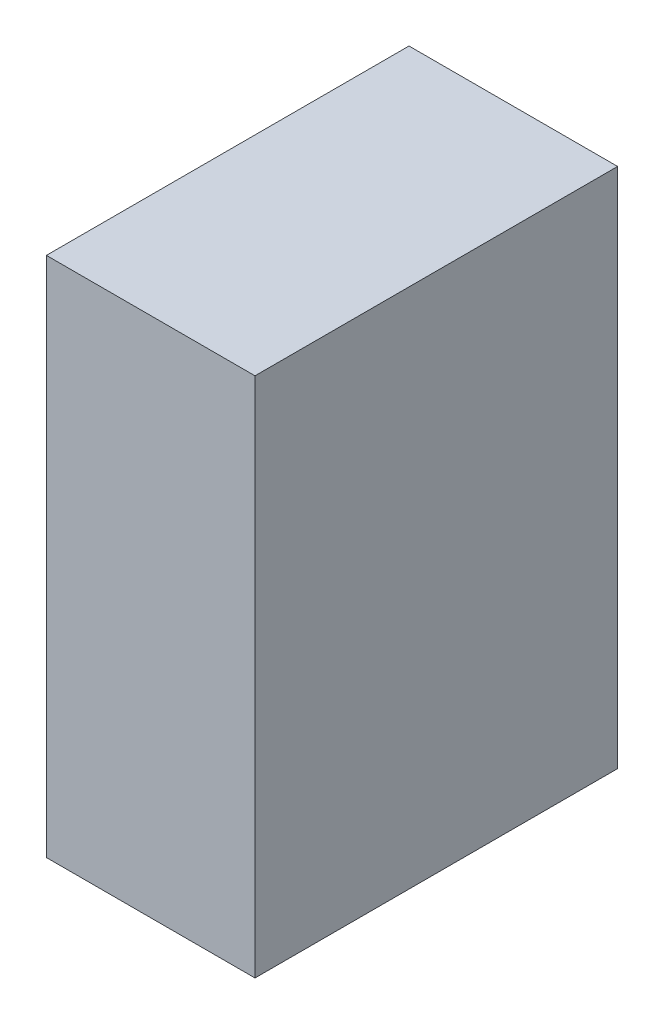
ISO-10303-21;
HEADER;
FILE_DESCRIPTION(('STEP AP214'),'2;1');
FILE_NAME('part.step','',(''),(''),'','','');
FILE_SCHEMA(('AUTOMOTIVE_DESIGN { 1 0 10303 214 1 1 1 1 }'));
ENDSEC;
DATA;
#1=APPLICATION_CONTEXT('core data for automotive mechanical design processes');
#2=APPLICATION_PROTOCOL_DEFINITION('international standard','automotive_design',2000,#1);
#3=PRODUCT_CONTEXT('',#1,'mechanical');
#4=PRODUCT('Part','Part','',(#3));
#5=PRODUCT_RELATED_PRODUCT_CATEGORY('part','',(#4));
#6=PRODUCT_DEFINITION_FORMATION('','',#4);
#7=PRODUCT_DEFINITION_CONTEXT('part definition',#1,'design');
#8=PRODUCT_DEFINITION('design','',#6,#7);
#9=PRODUCT_DEFINITION_SHAPE('','',#8);
#10=(LENGTH_UNIT() NAMED_UNIT(*) SI_UNIT(.MILLI.,.METRE.));
#11=(NAMED_UNIT(*) PLANE_ANGLE_UNIT() SI_UNIT($,.RADIAN.));
#12=(NAMED_UNIT(*) SI_UNIT($,.STERADIAN.) SOLID_ANGLE_UNIT());
#13=UNCERTAINTY_MEASURE_WITH_UNIT(LENGTH_MEASURE(1.E-05),#10,'distance_accuracy_value','');
#14=(GEOMETRIC_REPRESENTATION_CONTEXT(3) GLOBAL_UNCERTAINTY_ASSIGNED_CONTEXT((#13)) GLOBAL_UNIT_ASSIGNED_CONTEXT((#10,
#11,#12)) REPRESENTATION_CONTEXT('',''));
#15=CARTESIAN_POINT('',(0.,0.,0.));
#16=DIRECTION('',(0.,0.,1.));
#17=DIRECTION('',(1.,0.,0.));
#18=AXIS2_PLACEMENT_3D('',#15,#16,#17);
#19=CARTESIAN_POINT('',(3.64125341632052,-61.5,-36.98));
#20=DIRECTION('',(-1.,0.,0.));
#21=DIRECTION('',(0.,-1.,0.));
#22=AXIS2_PLACEMENT_3D('',#19,#20,#21);
#23=PLANE('',#22);
#24=DIRECTION('',(0.,-1.,0.));
#25=VECTOR('',#24,1.);
#26=CARTESIAN_POINT('',(3.64125341632052,-36.5,-36.99));
#27=LINE('',#26,#25);
#28=CARTESIAN_POINT('',(3.64125341632052,-36.5,-36.99));
#29=VERTEX_POINT('',#28);
#30=CARTESIAN_POINT('',(3.64125341632052,-61.5,-36.99));
#31=VERTEX_POINT('',#30);
#32=EDGE_CURVE('E37',#29,#31,#27,.T.);
#33=ORIENTED_EDGE('',*,*,#32,.T.);
#34=DIRECTION('',(0.,0.,-1.));
#35=VECTOR('',#34,1.);
#36=CARTESIAN_POINT('',(3.64125341632052,-61.5,-36.99));
#37=LINE('',#36,#35);
#38=CARTESIAN_POINT('',(3.64125341632052,-61.5,-54.3725396741245));
#39=VERTEX_POINT('',#38);
#40=EDGE_CURVE('E77',#31,#39,#37,.T.);
#41=ORIENTED_EDGE('',*,*,#40,.T.);
#42=DIRECTION('',(0.,1.,0.));
#43=VECTOR('',#42,1.);
#44=CARTESIAN_POINT('',(3.64125341632052,-61.5,-54.3725396741245));
#45=LINE('',#44,#43);
#46=CARTESIAN_POINT('',(3.64125341632052,-36.5,-54.3725396741245));
#47=VERTEX_POINT('',#46);
#48=EDGE_CURVE('E84',#39,#47,#45,.T.);
#49=ORIENTED_EDGE('',*,*,#48,.T.);
#50=DIRECTION('',(0.,0.,1.));
#51=VECTOR('',#50,1.);
#52=CARTESIAN_POINT('',(3.64125341632052,-36.5,-36.99));
#53=LINE('',#52,#51);
#54=EDGE_CURVE('E86',#47,#29,#53,.T.);
#55=ORIENTED_EDGE('',*,*,#54,.T.);
#56=EDGE_LOOP('',(#33,#41,#49,#55));
#57=FACE_BOUND('',#56,.T.);
#58=ADVANCED_FACE('F33',(#57),#23,.F.);
#59=CARTESIAN_POINT('',(-6.35874658367949,-61.5,-36.98));
#60=DIRECTION('',(-1.,0.,0.));
#61=DIRECTION('',(0.,-1.,0.));
#62=AXIS2_PLACEMENT_3D('',#59,#60,#61);
#63=PLANE('',#62);
#64=DIRECTION('',(0.,0.,1.));
#65=VECTOR('',#64,1.);
#66=CARTESIAN_POINT('',(-6.35874658367949,-36.5,-36.99));
#67=LINE('',#66,#65);
#68=CARTESIAN_POINT('',(-6.35874658367949,-36.5,-54.3725396741245));
#69=VERTEX_POINT('',#68);
#70=CARTESIAN_POINT('',(-6.35874658367949,-36.5,-36.99));
#71=VERTEX_POINT('',#70);
#72=EDGE_CURVE('E95',#69,#71,#67,.T.);
#73=ORIENTED_EDGE('',*,*,#72,.F.);
#74=DIRECTION('',(0.,1.,0.));
#75=VECTOR('',#74,1.);
#76=CARTESIAN_POINT('',(-6.35874658367949,-61.5,-54.3725396741245));
#77=LINE('',#76,#75);
#78=CARTESIAN_POINT('',(-6.35874658367949,-61.5,-54.3725396741245));
#79=VERTEX_POINT('',#78);
#80=EDGE_CURVE('E100',#79,#69,#77,.T.);
#81=ORIENTED_EDGE('',*,*,#80,.F.);
#82=DIRECTION('',(0.,0.,-1.));
#83=VECTOR('',#82,1.);
#84=CARTESIAN_POINT('',(-6.35874658367949,-61.5,-36.99));
#85=LINE('',#84,#83);
#86=CARTESIAN_POINT('',(-6.35874658367949,-61.5,-36.99));
#87=VERTEX_POINT('',#86);
#88=EDGE_CURVE('E103',#87,#79,#85,.T.);
#89=ORIENTED_EDGE('',*,*,#88,.F.);
#90=DIRECTION('',(0.,-1.,0.));
#91=VECTOR('',#90,1.);
#92=CARTESIAN_POINT('',(-6.35874658367949,-36.5,-36.99));
#93=LINE('',#92,#91);
#94=EDGE_CURVE('E50',#71,#87,#93,.T.);
#95=ORIENTED_EDGE('',*,*,#94,.F.);
#96=EDGE_LOOP('',(#73,#81,#89,#95));
#97=FACE_BOUND('',#96,.T.);
#98=ADVANCED_FACE('F107',(#97),#63,.T.);
#99=CARTESIAN_POINT('',(-15.,-61.5,-54.3725396741245));
#100=DIRECTION('',(0.,0.,-1.));
#101=DIRECTION('',(-1.,0.,0.));
#102=AXIS2_PLACEMENT_3D('',#99,#100,#101);
#103=PLANE('',#102);
#104=ORIENTED_EDGE('',*,*,#48,.F.);
#105=DIRECTION('',(1.,0.,0.));
#106=VECTOR('',#105,1.);
#107=CARTESIAN_POINT('',(-15.,-61.5,-54.3725396741245));
#108=LINE('',#107,#106);
#109=EDGE_CURVE('E81',#79,#39,#108,.T.);
#110=ORIENTED_EDGE('',*,*,#109,.F.);
#111=ORIENTED_EDGE('',*,*,#80,.T.);
#112=DIRECTION('',(1.,0.,0.));
#113=VECTOR('',#112,1.);
#114=CARTESIAN_POINT('',(-15.,-36.5,-54.3725396741245));
#115=LINE('',#114,#113);
#116=EDGE_CURVE('E88',#69,#47,#115,.T.);
#117=ORIENTED_EDGE('',*,*,#116,.T.);
#118=EDGE_LOOP('',(#104,#110,#111,#117));
#119=FACE_BOUND('',#118,.T.);
#120=ADVANCED_FACE('F98',(#119),#103,.T.);
#121=CARTESIAN_POINT('',(-15.,-61.5,-36.99));
#122=DIRECTION('',(0.,-1.,0.));
#123=DIRECTION('',(0.,0.,-1.));
#124=AXIS2_PLACEMENT_3D('',#121,#122,#123);
#125=PLANE('',#124);
#126=ORIENTED_EDGE('',*,*,#40,.F.);
#127=DIRECTION('',(1.,0.,0.));
#128=VECTOR('',#127,1.);
#129=CARTESIAN_POINT('',(-15.,-61.5,-36.99));
#130=LINE('',#129,#128);
#131=EDGE_CURVE('E42',#87,#31,#130,.T.);
#132=ORIENTED_EDGE('',*,*,#131,.F.);
#133=ORIENTED_EDGE('',*,*,#88,.T.);
#134=ORIENTED_EDGE('',*,*,#109,.T.);
#135=EDGE_LOOP('',(#126,#132,#133,#134));
#136=FACE_BOUND('',#135,.T.);
#137=ADVANCED_FACE('F79',(#136),#125,.T.);
#138=CARTESIAN_POINT('',(-15.,-36.5,-36.99));
#139=DIRECTION('',(0.,1.,0.));
#140=DIRECTION('',(0.,0.,1.));
#141=AXIS2_PLACEMENT_3D('',#138,#139,#140);
#142=PLANE('',#141);
#143=ORIENTED_EDGE('',*,*,#54,.F.);
#144=ORIENTED_EDGE('',*,*,#116,.F.);
#145=ORIENTED_EDGE('',*,*,#72,.T.);
#146=DIRECTION('',(1.,0.,0.));
#147=VECTOR('',#146,1.);
#148=CARTESIAN_POINT('',(-15.,-36.5,-36.99));
#149=LINE('',#148,#147);
#150=EDGE_CURVE('E11',#71,#29,#149,.T.);
#151=ORIENTED_EDGE('',*,*,#150,.T.);
#152=EDGE_LOOP('',(#143,#144,#145,#151));
#153=FACE_BOUND('',#152,.T.);
#154=ADVANCED_FACE('F102',(#153),#142,.T.);
#155=CARTESIAN_POINT('',(-15.,-36.5,-36.99));
#156=DIRECTION('',(0.,0.,1.));
#157=DIRECTION('',(0.,-1.,0.));
#158=AXIS2_PLACEMENT_3D('',#155,#156,#157);
#159=PLANE('',#158);
#160=ORIENTED_EDGE('',*,*,#32,.F.);
#161=ORIENTED_EDGE('',*,*,#150,.F.);
#162=ORIENTED_EDGE('',*,*,#94,.T.);
#163=ORIENTED_EDGE('',*,*,#131,.T.);
#164=EDGE_LOOP('',(#160,#161,#162,#163));
#165=FACE_BOUND('',#164,.T.);
#166=ADVANCED_FACE('F35',(#165),#159,.T.);
#167=CLOSED_SHELL('',(#58,#98,#120,#137,#154,#166));
#168=MANIFOLD_SOLID_BREP('B2',#167);
#169=ADVANCED_BREP_SHAPE_REPRESENTATION('',(#18,#168),#14);
#170=SHAPE_DEFINITION_REPRESENTATION(#9,#169);
ENDSEC;
END-ISO-10303-21;
